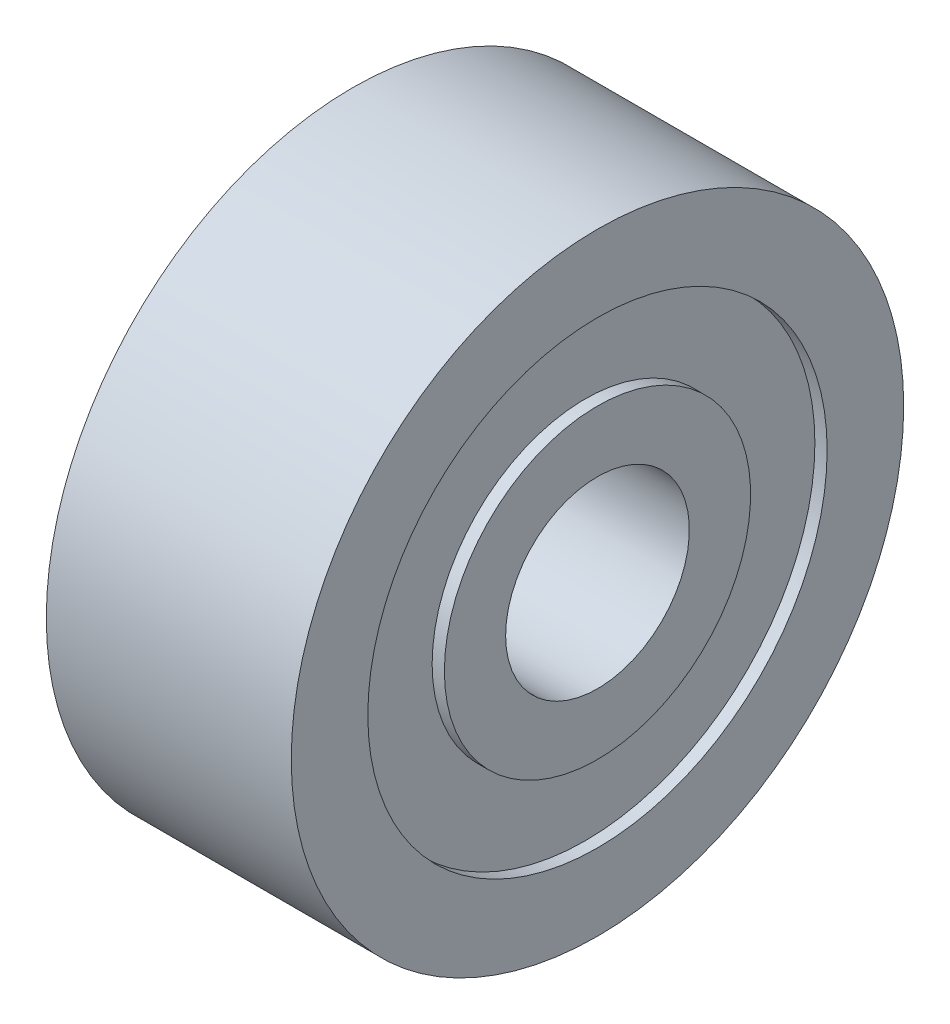
ISO-10303-21;
HEADER;
FILE_DESCRIPTION(('STEP AP214'),'2;1');
FILE_NAME('part.step','',(''),(''),'','','');
FILE_SCHEMA(('AUTOMOTIVE_DESIGN { 1 0 10303 214 1 1 1 1 }'));
ENDSEC;
DATA;
#1=APPLICATION_CONTEXT('core data for automotive mechanical design processes');
#2=APPLICATION_PROTOCOL_DEFINITION('international standard','automotive_design',2000,#1);
#3=PRODUCT_CONTEXT('',#1,'mechanical');
#4=PRODUCT('Part','Part','',(#3));
#5=PRODUCT_RELATED_PRODUCT_CATEGORY('part','',(#4));
#6=PRODUCT_DEFINITION_FORMATION('','',#4);
#7=PRODUCT_DEFINITION_CONTEXT('part definition',#1,'design');
#8=PRODUCT_DEFINITION('design','',#6,#7);
#9=PRODUCT_DEFINITION_SHAPE('','',#8);
#10=(LENGTH_UNIT() NAMED_UNIT(*) SI_UNIT(.MILLI.,.METRE.));
#11=(NAMED_UNIT(*) PLANE_ANGLE_UNIT() SI_UNIT($,.RADIAN.));
#12=(NAMED_UNIT(*) SI_UNIT($,.STERADIAN.) SOLID_ANGLE_UNIT());
#13=UNCERTAINTY_MEASURE_WITH_UNIT(LENGTH_MEASURE(1.E-05),#10,'distance_accuracy_value','');
#14=(GEOMETRIC_REPRESENTATION_CONTEXT(3) GLOBAL_UNCERTAINTY_ASSIGNED_CONTEXT((#13)) GLOBAL_UNIT_ASSIGNED_CONTEXT((#10,
#11,#12)) REPRESENTATION_CONTEXT('',''));
#15=CARTESIAN_POINT('',(0.,0.,0.));
#16=DIRECTION('',(0.,0.,1.));
#17=DIRECTION('',(1.,0.,0.));
#18=AXIS2_PLACEMENT_3D('',#15,#16,#17);
#19=CARTESIAN_POINT('',(-2.,2.5,0.));
#20=DIRECTION('',(1.,0.,0.));
#21=DIRECTION('',(0.,0.,-1.));
#22=AXIS2_PLACEMENT_3D('',#19,#20,#21);
#23=PLANE('',#22);
#24=CARTESIAN_POINT('',(-2.,0.,0.));
#25=DIRECTION('',(-1.,0.,0.));
#26=DIRECTION('',(0.,0.,1.));
#27=AXIS2_PLACEMENT_3D('',#24,#25,#26);
#28=CIRCLE('',#27,1.5);
#29=CARTESIAN_POINT('',(-2.,0.,1.5));
#30=VERTEX_POINT('',#29);
#31=EDGE_CURVE('E10',#30,#30,#28,.T.);
#32=ORIENTED_EDGE('',*,*,#31,.F.);
#33=EDGE_LOOP('',(#32));
#34=FACE_BOUND('',#33,.T.);
#35=CARTESIAN_POINT('',(-2.,0.,0.));
#36=DIRECTION('',(-1.,0.,0.));
#37=DIRECTION('',(0.,0.,1.));
#38=AXIS2_PLACEMENT_3D('',#35,#36,#37);
#39=CIRCLE('',#38,2.5);
#40=CARTESIAN_POINT('',(-2.,0.,2.5));
#41=VERTEX_POINT('',#40);
#42=EDGE_CURVE('E72',#41,#41,#39,.T.);
#43=ORIENTED_EDGE('',*,*,#42,.T.);
#44=EDGE_LOOP('',(#43));
#45=FACE_BOUND('',#44,.T.);
#46=ADVANCED_FACE('F32',(#34,#45),#23,.F.);
#47=CARTESIAN_POINT('',(-2.,0.,0.));
#48=DIRECTION('',(-1.,0.,0.));
#49=DIRECTION('',(0.,0.,1.));
#50=AXIS2_PLACEMENT_3D('',#47,#48,#49);
#51=CYLINDRICAL_SURFACE('',#50,1.5);
#52=CARTESIAN_POINT('',(2.,0.,0.));
#53=DIRECTION('',(-1.,0.,0.));
#54=DIRECTION('',(0.,0.,1.));
#55=AXIS2_PLACEMENT_3D('',#52,#53,#54);
#56=CIRCLE('',#55,1.5);
#57=CARTESIAN_POINT('',(2.,0.,1.5));
#58=VERTEX_POINT('',#57);
#59=EDGE_CURVE('E38',#58,#58,#56,.T.);
#60=ORIENTED_EDGE('',*,*,#59,.F.);
#61=EDGE_LOOP('',(#60));
#62=FACE_BOUND('',#61,.T.);
#63=ORIENTED_EDGE('',*,*,#31,.T.);
#64=EDGE_LOOP('',(#63));
#65=FACE_BOUND('',#64,.T.);
#66=ADVANCED_FACE('F133',(#62,#65),#51,.F.);
#67=CARTESIAN_POINT('',(2.,2.5,0.));
#68=DIRECTION('',(-1.,0.,0.));
#69=DIRECTION('',(0.,0.,1.));
#70=AXIS2_PLACEMENT_3D('',#67,#68,#69);
#71=PLANE('',#70);
#72=CARTESIAN_POINT('',(2.,0.,0.));
#73=DIRECTION('',(-1.,0.,0.));
#74=DIRECTION('',(0.,0.,1.));
#75=AXIS2_PLACEMENT_3D('',#72,#73,#74);
#76=CIRCLE('',#75,2.5);
#77=CARTESIAN_POINT('',(2.,0.,2.5));
#78=VERTEX_POINT('',#77);
#79=EDGE_CURVE('E42',#78,#78,#76,.T.);
#80=ORIENTED_EDGE('',*,*,#79,.F.);
#81=EDGE_LOOP('',(#80));
#82=FACE_BOUND('',#81,.T.);
#83=ORIENTED_EDGE('',*,*,#59,.T.);
#84=EDGE_LOOP('',(#83));
#85=FACE_BOUND('',#84,.T.);
#86=ADVANCED_FACE('F128',(#82,#85),#71,.F.);
#87=CARTESIAN_POINT('',(-2.,0.,0.));
#88=DIRECTION('',(-1.,0.,0.));
#89=DIRECTION('',(0.,0.,1.));
#90=AXIS2_PLACEMENT_3D('',#87,#88,#89);
#91=CYLINDRICAL_SURFACE('',#90,2.5);
#92=CARTESIAN_POINT('',(1.8,0.,0.));
#93=DIRECTION('',(-1.,0.,0.));
#94=DIRECTION('',(0.,0.,1.));
#95=AXIS2_PLACEMENT_3D('',#92,#93,#94);
#96=CIRCLE('',#95,2.5);
#97=CARTESIAN_POINT('',(1.8,0.,2.5));
#98=VERTEX_POINT('',#97);
#99=EDGE_CURVE('E46',#98,#98,#96,.T.);
#100=ORIENTED_EDGE('',*,*,#99,.F.);
#101=EDGE_LOOP('',(#100));
#102=FACE_BOUND('',#101,.T.);
#103=ORIENTED_EDGE('',*,*,#79,.T.);
#104=EDGE_LOOP('',(#103));
#105=FACE_BOUND('',#104,.T.);
#106=ADVANCED_FACE('F122',(#102,#105),#91,.T.);
#107=CARTESIAN_POINT('',(1.8,3.75,0.));
#108=DIRECTION('',(-1.,0.,0.));
#109=DIRECTION('',(0.,0.,1.));
#110=AXIS2_PLACEMENT_3D('',#107,#108,#109);
#111=PLANE('',#110);
#112=CARTESIAN_POINT('',(1.8,0.,0.));
#113=DIRECTION('',(-1.,0.,0.));
#114=DIRECTION('',(0.,0.,1.));
#115=AXIS2_PLACEMENT_3D('',#112,#113,#114);
#116=CIRCLE('',#115,3.75);
#117=CARTESIAN_POINT('',(1.8,0.,3.75));
#118=VERTEX_POINT('',#117);
#119=EDGE_CURVE('E51',#118,#118,#116,.T.);
#120=ORIENTED_EDGE('',*,*,#119,.F.);
#121=EDGE_LOOP('',(#120));
#122=FACE_BOUND('',#121,.T.);
#123=ORIENTED_EDGE('',*,*,#99,.T.);
#124=EDGE_LOOP('',(#123));
#125=FACE_BOUND('',#124,.T.);
#126=ADVANCED_FACE('F116',(#122,#125),#111,.F.);
#127=CARTESIAN_POINT('',(-2.,0.,0.));
#128=DIRECTION('',(-1.,0.,0.));
#129=DIRECTION('',(0.,0.,1.));
#130=AXIS2_PLACEMENT_3D('',#127,#128,#129);
#131=CYLINDRICAL_SURFACE('',#130,3.75);
#132=CARTESIAN_POINT('',(2.,0.,0.));
#133=DIRECTION('',(-1.,0.,0.));
#134=DIRECTION('',(0.,0.,1.));
#135=AXIS2_PLACEMENT_3D('',#132,#133,#134);
#136=CIRCLE('',#135,3.75);
#137=CARTESIAN_POINT('',(2.,0.,3.75));
#138=VERTEX_POINT('',#137);
#139=EDGE_CURVE('E54',#138,#138,#136,.T.);
#140=ORIENTED_EDGE('',*,*,#139,.F.);
#141=EDGE_LOOP('',(#140));
#142=FACE_BOUND('',#141,.T.);
#143=ORIENTED_EDGE('',*,*,#119,.T.);
#144=EDGE_LOOP('',(#143));
#145=FACE_BOUND('',#144,.T.);
#146=ADVANCED_FACE('F110',(#142,#145),#131,.F.);
#147=CARTESIAN_POINT('',(2.,5.,0.));
#148=DIRECTION('',(-1.,0.,0.));
#149=DIRECTION('',(0.,0.,1.));
#150=AXIS2_PLACEMENT_3D('',#147,#148,#149);
#151=PLANE('',#150);
#152=CARTESIAN_POINT('',(2.,0.,0.));
#153=DIRECTION('',(-1.,0.,0.));
#154=DIRECTION('',(0.,0.,1.));
#155=AXIS2_PLACEMENT_3D('',#152,#153,#154);
#156=CIRCLE('',#155,5.);
#157=CARTESIAN_POINT('',(2.,0.,5.));
#158=VERTEX_POINT('',#157);
#159=EDGE_CURVE('E57',#158,#158,#156,.T.);
#160=ORIENTED_EDGE('',*,*,#159,.F.);
#161=EDGE_LOOP('',(#160));
#162=FACE_BOUND('',#161,.T.);
#163=ORIENTED_EDGE('',*,*,#139,.T.);
#164=EDGE_LOOP('',(#163));
#165=FACE_BOUND('',#164,.T.);
#166=ADVANCED_FACE('F104',(#162,#165),#151,.F.);
#167=CARTESIAN_POINT('',(-2.,0.,0.));
#168=DIRECTION('',(-1.,0.,0.));
#169=DIRECTION('',(0.,0.,1.));
#170=AXIS2_PLACEMENT_3D('',#167,#168,#169);
#171=CYLINDRICAL_SURFACE('',#170,5.);
#172=CARTESIAN_POINT('',(-2.,0.,0.));
#173=DIRECTION('',(-1.,0.,0.));
#174=DIRECTION('',(0.,0.,1.));
#175=AXIS2_PLACEMENT_3D('',#172,#173,#174);
#176=CIRCLE('',#175,5.);
#177=CARTESIAN_POINT('',(-2.,0.,5.));
#178=VERTEX_POINT('',#177);
#179=EDGE_CURVE('E60',#178,#178,#176,.T.);
#180=ORIENTED_EDGE('',*,*,#179,.F.);
#181=EDGE_LOOP('',(#180));
#182=FACE_BOUND('',#181,.T.);
#183=ORIENTED_EDGE('',*,*,#159,.T.);
#184=EDGE_LOOP('',(#183));
#185=FACE_BOUND('',#184,.T.);
#186=ADVANCED_FACE('F98',(#182,#185),#171,.T.);
#187=CARTESIAN_POINT('',(-2.,5.,0.));
#188=DIRECTION('',(1.,0.,0.));
#189=DIRECTION('',(0.,0.,-1.));
#190=AXIS2_PLACEMENT_3D('',#187,#188,#189);
#191=PLANE('',#190);
#192=CARTESIAN_POINT('',(-2.,0.,0.));
#193=DIRECTION('',(-1.,0.,0.));
#194=DIRECTION('',(0.,0.,1.));
#195=AXIS2_PLACEMENT_3D('',#192,#193,#194);
#196=CIRCLE('',#195,3.75);
#197=CARTESIAN_POINT('',(-2.,0.,3.75));
#198=VERTEX_POINT('',#197);
#199=EDGE_CURVE('E63',#198,#198,#196,.T.);
#200=ORIENTED_EDGE('',*,*,#199,.F.);
#201=EDGE_LOOP('',(#200));
#202=FACE_BOUND('',#201,.T.);
#203=ORIENTED_EDGE('',*,*,#179,.T.);
#204=EDGE_LOOP('',(#203));
#205=FACE_BOUND('',#204,.T.);
#206=ADVANCED_FACE('F92',(#202,#205),#191,.F.);
#207=CARTESIAN_POINT('',(-2.,0.,0.));
#208=DIRECTION('',(-1.,0.,0.));
#209=DIRECTION('',(0.,0.,1.));
#210=AXIS2_PLACEMENT_3D('',#207,#208,#209);
#211=CYLINDRICAL_SURFACE('',#210,3.75);
#212=CARTESIAN_POINT('',(-1.8,0.,0.));
#213=DIRECTION('',(-1.,0.,0.));
#214=DIRECTION('',(0.,0.,1.));
#215=AXIS2_PLACEMENT_3D('',#212,#213,#214);
#216=CIRCLE('',#215,3.75);
#217=CARTESIAN_POINT('',(-1.8,0.,3.75));
#218=VERTEX_POINT('',#217);
#219=EDGE_CURVE('E66',#218,#218,#216,.T.);
#220=ORIENTED_EDGE('',*,*,#219,.F.);
#221=EDGE_LOOP('',(#220));
#222=FACE_BOUND('',#221,.T.);
#223=ORIENTED_EDGE('',*,*,#199,.T.);
#224=EDGE_LOOP('',(#223));
#225=FACE_BOUND('',#224,.T.);
#226=ADVANCED_FACE('F86',(#222,#225),#211,.F.);
#227=CARTESIAN_POINT('',(-1.8,3.75,0.));
#228=DIRECTION('',(1.,0.,0.));
#229=DIRECTION('',(0.,0.,-1.));
#230=AXIS2_PLACEMENT_3D('',#227,#228,#229);
#231=PLANE('',#230);
#232=CARTESIAN_POINT('',(-1.8,0.,0.));
#233=DIRECTION('',(-1.,0.,0.));
#234=DIRECTION('',(0.,0.,1.));
#235=AXIS2_PLACEMENT_3D('',#232,#233,#234);
#236=CIRCLE('',#235,2.5);
#237=CARTESIAN_POINT('',(-1.8,0.,2.5));
#238=VERTEX_POINT('',#237);
#239=EDGE_CURVE('E69',#238,#238,#236,.T.);
#240=ORIENTED_EDGE('',*,*,#239,.F.);
#241=EDGE_LOOP('',(#240));
#242=FACE_BOUND('',#241,.T.);
#243=ORIENTED_EDGE('',*,*,#219,.T.);
#244=EDGE_LOOP('',(#243));
#245=FACE_BOUND('',#244,.T.);
#246=ADVANCED_FACE('F80',(#242,#245),#231,.F.);
#247=CARTESIAN_POINT('',(-2.,0.,0.));
#248=DIRECTION('',(-1.,0.,0.));
#249=DIRECTION('',(0.,0.,1.));
#250=AXIS2_PLACEMENT_3D('',#247,#248,#249);
#251=CYLINDRICAL_SURFACE('',#250,2.5);
#252=ORIENTED_EDGE('',*,*,#42,.F.);
#253=EDGE_LOOP('',(#252));
#254=FACE_BOUND('',#253,.T.);
#255=ORIENTED_EDGE('',*,*,#239,.T.);
#256=EDGE_LOOP('',(#255));
#257=FACE_BOUND('',#256,.T.);
#258=ADVANCED_FACE('F77',(#254,#257),#251,.T.);
#259=CLOSED_SHELL('',(#46,#66,#86,#106,#126,#146,#166,#186,#206,#226,#246,#258));
#260=MANIFOLD_SOLID_BREP('B2',#259);
#261=ADVANCED_BREP_SHAPE_REPRESENTATION('',(#18,#260),#14);
#262=SHAPE_DEFINITION_REPRESENTATION(#9,#261);
ENDSEC;
END-ISO-10303-21;
